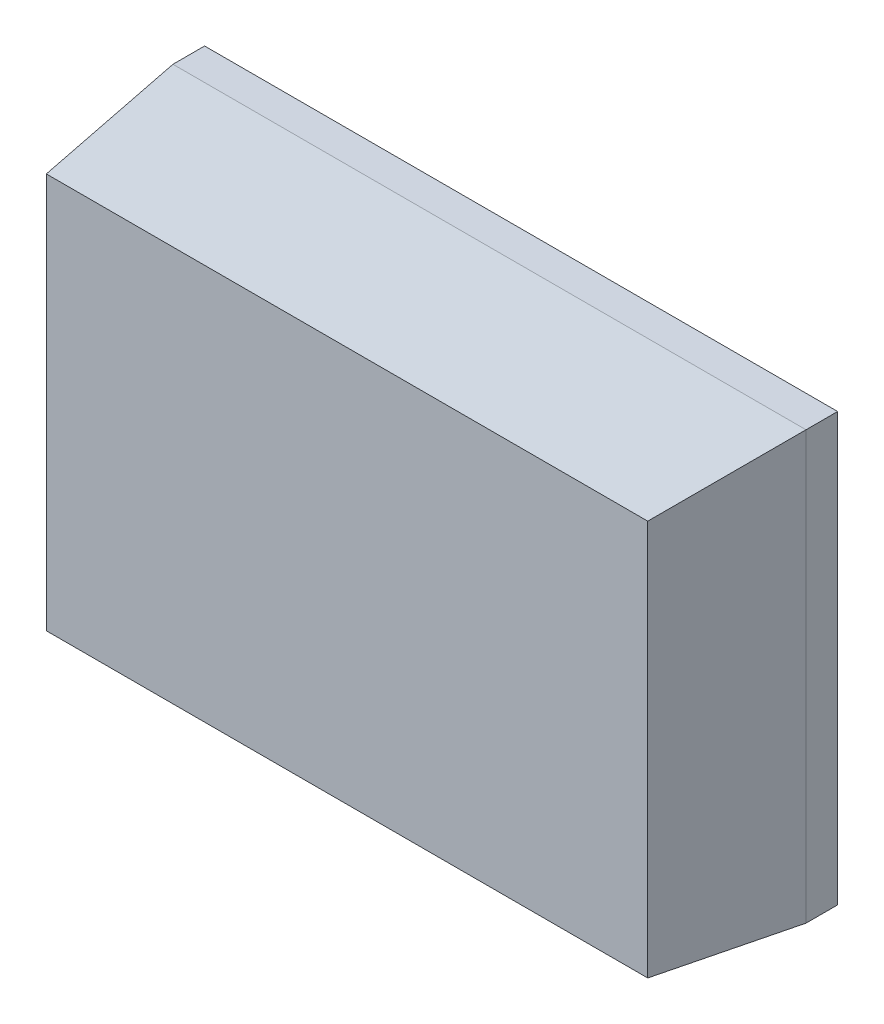
ISO-10303-21;
HEADER;
FILE_DESCRIPTION(('STEP AP214'),'2;1');
FILE_NAME('part.step','',(''),(''),'','','');
FILE_SCHEMA(('AUTOMOTIVE_DESIGN { 1 0 10303 214 1 1 1 1 }'));
ENDSEC;
DATA;
#1=APPLICATION_CONTEXT('core data for automotive mechanical design processes');
#2=APPLICATION_PROTOCOL_DEFINITION('international standard','automotive_design',2000,#1);
#3=PRODUCT_CONTEXT('',#1,'mechanical');
#4=PRODUCT('Part','Part','',(#3));
#5=PRODUCT_RELATED_PRODUCT_CATEGORY('part','',(#4));
#6=PRODUCT_DEFINITION_FORMATION('','',#4);
#7=PRODUCT_DEFINITION_CONTEXT('part definition',#1,'design');
#8=PRODUCT_DEFINITION('design','',#6,#7);
#9=PRODUCT_DEFINITION_SHAPE('','',#8);
#10=(LENGTH_UNIT() NAMED_UNIT(*) SI_UNIT(.MILLI.,.METRE.));
#11=(NAMED_UNIT(*) PLANE_ANGLE_UNIT() SI_UNIT($,.RADIAN.));
#12=(NAMED_UNIT(*) SI_UNIT($,.STERADIAN.) SOLID_ANGLE_UNIT());
#13=UNCERTAINTY_MEASURE_WITH_UNIT(LENGTH_MEASURE(1.E-05),#10,'distance_accuracy_value','');
#14=(GEOMETRIC_REPRESENTATION_CONTEXT(3) GLOBAL_UNCERTAINTY_ASSIGNED_CONTEXT((#13)) GLOBAL_UNIT_ASSIGNED_CONTEXT((#10,
#11,#12)) REPRESENTATION_CONTEXT('',''));
#15=CARTESIAN_POINT('',(0.,0.,0.));
#16=DIRECTION('',(0.,0.,1.));
#17=DIRECTION('',(1.,0.,0.));
#18=AXIS2_PLACEMENT_3D('',#15,#16,#17);
#19=CARTESIAN_POINT('',(0.,0.,1.1));
#20=DIRECTION('',(0.,0.,1.));
#21=DIRECTION('',(1.,0.,0.));
#22=AXIS2_PLACEMENT_3D('',#19,#20,#21);
#23=PLANE('',#22);
#24=DIRECTION('',(1.,0.,0.));
#25=VECTOR('',#24,1.);
#26=CARTESIAN_POINT('',(0.,0.1,1.1));
#27=LINE('',#26,#25);
#28=CARTESIAN_POINT('',(3.9,0.1,1.1));
#29=VERTEX_POINT('',#28);
#30=CARTESIAN_POINT('',(0.1,0.1,1.1));
#31=VERTEX_POINT('',#30);
#32=EDGE_CURVE('E71',#29,#31,#27,.F.);
#33=ORIENTED_EDGE('',*,*,#32,.F.);
#34=DIRECTION('',(0.,1.,0.));
#35=VECTOR('',#34,1.);
#36=CARTESIAN_POINT('',(3.9,0.,1.1));
#37=LINE('',#36,#35);
#38=CARTESIAN_POINT('',(3.9,2.6,1.1));
#39=VERTEX_POINT('',#38);
#40=EDGE_CURVE('E66',#39,#29,#37,.F.);
#41=ORIENTED_EDGE('',*,*,#40,.F.);
#42=DIRECTION('',(1.,0.,0.));
#43=VECTOR('',#42,1.);
#44=CARTESIAN_POINT('',(0.,2.6,1.1));
#45=LINE('',#44,#43);
#46=CARTESIAN_POINT('',(0.1,2.6,1.1));
#47=VERTEX_POINT('',#46);
#48=EDGE_CURVE('E82',#47,#39,#45,.T.);
#49=ORIENTED_EDGE('',*,*,#48,.F.);
#50=DIRECTION('',(0.,1.,0.));
#51=VECTOR('',#50,1.);
#52=CARTESIAN_POINT('',(0.1,0.,1.1));
#53=LINE('',#52,#51);
#54=EDGE_CURVE('E20',#31,#47,#53,.T.);
#55=ORIENTED_EDGE('',*,*,#54,.F.);
#56=EDGE_LOOP('',(#33,#41,#49,#55));
#57=FACE_BOUND('',#56,.T.);
#58=ADVANCED_FACE('F17',(#57),#23,.T.);
#59=CARTESIAN_POINT('',(0.1,0.,1.1));
#60=DIRECTION('',(-0.993883734673607,0.,0.110431526074956));
#61=DIRECTION('',(0.110431526074956,0.,0.993883734673607));
#62=AXIS2_PLACEMENT_3D('',#59,#60,#61);
#63=PLANE('',#62);
#64=DIRECTION('',(-0.10976425998969,-0.109764259989799,-0.987878339907201));
#65=VECTOR('',#64,1.);
#66=CARTESIAN_POINT('',(0.1,0.1,1.1));
#67=LINE('',#66,#65);
#68=CARTESIAN_POINT('',(0.,0.,0.200000000000007));
#69=VERTEX_POINT('',#68);
#70=EDGE_CURVE('E76',#31,#69,#67,.T.);
#71=ORIENTED_EDGE('',*,*,#70,.F.);
#72=ORIENTED_EDGE('',*,*,#54,.T.);
#73=DIRECTION('',(0.10976425998969,-0.1097642599898,0.987878339907201));
#74=VECTOR('',#73,1.);
#75=CARTESIAN_POINT('',(0.,2.7000000000001,0.200000000000011));
#76=LINE('',#75,#74);
#77=CARTESIAN_POINT('',(0.,2.70000000000001,0.200000000000007));
#78=VERTEX_POINT('',#77);
#79=EDGE_CURVE('E95',#78,#47,#76,.T.);
#80=ORIENTED_EDGE('',*,*,#79,.F.);
#81=DIRECTION('',(0.,1.,0.));
#82=VECTOR('',#81,1.);
#83=CARTESIAN_POINT('',(0.,2.7,0.2));
#84=LINE('',#83,#82);
#85=EDGE_CURVE('E87',#78,#69,#84,.F.);
#86=ORIENTED_EDGE('',*,*,#85,.T.);
#87=EDGE_LOOP('',(#71,#72,#80,#86));
#88=FACE_BOUND('',#87,.T.);
#89=ADVANCED_FACE('F86',(#88),#63,.T.);
#90=CARTESIAN_POINT('',(0.,0.1,1.1));
#91=DIRECTION('',(0.,-0.993883734673607,0.110431526074956));
#92=DIRECTION('',(0.,-0.110431526074956,-0.993883734673607));
#93=AXIS2_PLACEMENT_3D('',#90,#91,#92);
#94=PLANE('',#93);
#95=DIRECTION('',(1.,0.,0.));
#96=VECTOR('',#95,1.);
#97=CARTESIAN_POINT('',(0.,0.,0.2));
#98=LINE('',#97,#96);
#99=CARTESIAN_POINT('',(4.00000000000001,0.,0.200000000000007));
#100=VERTEX_POINT('',#99);
#101=EDGE_CURVE('E102',#69,#100,#98,.T.);
#102=ORIENTED_EDGE('',*,*,#101,.T.);
#103=DIRECTION('',(0.109764259989799,-0.109764259989691,-0.987878339907201));
#104=VECTOR('',#103,1.);
#105=CARTESIAN_POINT('',(3.9,0.1,1.1));
#106=LINE('',#105,#104);
#107=EDGE_CURVE('E78',#29,#100,#106,.T.);
#108=ORIENTED_EDGE('',*,*,#107,.F.);
#109=ORIENTED_EDGE('',*,*,#32,.T.);
#110=ORIENTED_EDGE('',*,*,#70,.T.);
#111=EDGE_LOOP('',(#102,#108,#109,#110));
#112=FACE_BOUND('',#111,.T.);
#113=ADVANCED_FACE('F74',(#112),#94,.T.);
#114=CARTESIAN_POINT('',(3.9,0.,1.1));
#115=DIRECTION('',(0.993883734673607,0.,0.110431526074956));
#116=DIRECTION('',(0.110431526074956,0.,-0.993883734673607));
#117=AXIS2_PLACEMENT_3D('',#114,#115,#116);
#118=PLANE('',#117);
#119=ORIENTED_EDGE('',*,*,#107,.T.);
#120=DIRECTION('',(0.,1.,0.));
#121=VECTOR('',#120,1.);
#122=CARTESIAN_POINT('',(4.,0.,0.2));
#123=LINE('',#122,#121);
#124=CARTESIAN_POINT('',(4.00000000000005,2.70000000000001,0.200000000000007));
#125=VERTEX_POINT('',#124);
#126=EDGE_CURVE('E107',#100,#125,#123,.T.);
#127=ORIENTED_EDGE('',*,*,#126,.T.);
#128=DIRECTION('',(0.109764259989691,0.1097642599898,-0.987878339907201));
#129=VECTOR('',#128,1.);
#130=CARTESIAN_POINT('',(3.9,2.6,1.1));
#131=LINE('',#130,#129);
#132=EDGE_CURVE('E93',#39,#125,#131,.T.);
#133=ORIENTED_EDGE('',*,*,#132,.F.);
#134=ORIENTED_EDGE('',*,*,#40,.T.);
#135=EDGE_LOOP('',(#119,#127,#133,#134));
#136=FACE_BOUND('',#135,.T.);
#137=ADVANCED_FACE('F154',(#136),#118,.T.);
#138=CARTESIAN_POINT('',(0.,2.6,1.1));
#139=DIRECTION('',(0.,0.993883734673607,0.110431526074956));
#140=DIRECTION('',(0.,-0.110431526074956,0.993883734673607));
#141=AXIS2_PLACEMENT_3D('',#138,#139,#140);
#142=PLANE('',#141);
#143=ORIENTED_EDGE('',*,*,#79,.T.);
#144=ORIENTED_EDGE('',*,*,#48,.T.);
#145=ORIENTED_EDGE('',*,*,#132,.T.);
#146=DIRECTION('',(1.,0.,0.));
#147=VECTOR('',#146,1.);
#148=CARTESIAN_POINT('',(4.,2.7,0.2));
#149=LINE('',#148,#147);
#150=EDGE_CURVE('E114',#125,#78,#149,.F.);
#151=ORIENTED_EDGE('',*,*,#150,.T.);
#152=EDGE_LOOP('',(#143,#144,#145,#151));
#153=FACE_BOUND('',#152,.T.);
#154=ADVANCED_FACE('F151',(#153),#142,.T.);
#155=CARTESIAN_POINT('',(0.,2.7,1.1));
#156=DIRECTION('',(1.,0.,0.));
#157=DIRECTION('',(0.,0.,-1.));
#158=AXIS2_PLACEMENT_3D('',#155,#156,#157);
#159=PLANE('',#158);
#160=DIRECTION('',(0.,0.,-1.));
#161=VECTOR('',#160,1.);
#162=CARTESIAN_POINT('',(0.,2.7,1.1));
#163=LINE('',#162,#161);
#164=CARTESIAN_POINT('',(0.,2.7,0.));
#165=VERTEX_POINT('',#164);
#166=EDGE_CURVE('E110',#78,#165,#163,.T.);
#167=ORIENTED_EDGE('',*,*,#166,.T.);
#168=DIRECTION('',(0.,1.,0.));
#169=VECTOR('',#168,1.);
#170=CARTESIAN_POINT('',(0.,0.,0.));
#171=LINE('',#170,#169);
#172=CARTESIAN_POINT('',(0.,0.,0.));
#173=VERTEX_POINT('',#172);
#174=EDGE_CURVE('E117',#165,#173,#171,.F.);
#175=ORIENTED_EDGE('',*,*,#174,.T.);
#176=DIRECTION('',(0.,0.,1.));
#177=VECTOR('',#176,1.);
#178=CARTESIAN_POINT('',(0.,0.,1.1));
#179=LINE('',#178,#177);
#180=EDGE_CURVE('E99',#173,#69,#179,.T.);
#181=ORIENTED_EDGE('',*,*,#180,.T.);
#182=ORIENTED_EDGE('',*,*,#85,.F.);
#183=EDGE_LOOP('',(#167,#175,#181,#182));
#184=FACE_BOUND('',#183,.T.);
#185=ADVANCED_FACE('F134',(#184),#159,.F.);
#186=CARTESIAN_POINT('',(0.,0.,1.1));
#187=DIRECTION('',(0.,1.,0.));
#188=DIRECTION('',(0.,0.,1.));
#189=AXIS2_PLACEMENT_3D('',#186,#187,#188);
#190=PLANE('',#189);
#191=ORIENTED_EDGE('',*,*,#180,.F.);
#192=DIRECTION('',(1.,0.,0.));
#193=VECTOR('',#192,1.);
#194=CARTESIAN_POINT('',(0.,0.,0.));
#195=LINE('',#194,#193);
#196=CARTESIAN_POINT('',(4.,0.,0.));
#197=VERTEX_POINT('',#196);
#198=EDGE_CURVE('E120',#173,#197,#195,.T.);
#199=ORIENTED_EDGE('',*,*,#198,.T.);
#200=DIRECTION('',(0.,0.,1.));
#201=VECTOR('',#200,1.);
#202=CARTESIAN_POINT('',(4.,0.,1.1));
#203=LINE('',#202,#201);
#204=EDGE_CURVE('E104',#197,#100,#203,.T.);
#205=ORIENTED_EDGE('',*,*,#204,.T.);
#206=ORIENTED_EDGE('',*,*,#101,.F.);
#207=EDGE_LOOP('',(#191,#199,#205,#206));
#208=FACE_BOUND('',#207,.T.);
#209=ADVANCED_FACE('F132',(#208),#190,.F.);
#210=CARTESIAN_POINT('',(4.,0.,1.1));
#211=DIRECTION('',(-1.,0.,0.));
#212=DIRECTION('',(0.,0.,1.));
#213=AXIS2_PLACEMENT_3D('',#210,#211,#212);
#214=PLANE('',#213);
#215=ORIENTED_EDGE('',*,*,#204,.F.);
#216=DIRECTION('',(0.,1.,0.));
#217=VECTOR('',#216,1.);
#218=CARTESIAN_POINT('',(4.,0.,0.));
#219=LINE('',#218,#217);
#220=CARTESIAN_POINT('',(4.,2.7,0.));
#221=VERTEX_POINT('',#220);
#222=EDGE_CURVE('E26',#197,#221,#219,.T.);
#223=ORIENTED_EDGE('',*,*,#222,.T.);
#224=DIRECTION('',(0.,0.,-1.));
#225=VECTOR('',#224,1.);
#226=CARTESIAN_POINT('',(4.,2.7,1.1));
#227=LINE('',#226,#225);
#228=EDGE_CURVE('E34',#221,#125,#227,.F.);
#229=ORIENTED_EDGE('',*,*,#228,.T.);
#230=ORIENTED_EDGE('',*,*,#126,.F.);
#231=EDGE_LOOP('',(#215,#223,#229,#230));
#232=FACE_BOUND('',#231,.T.);
#233=ADVANCED_FACE('F126',(#232),#214,.F.);
#234=CARTESIAN_POINT('',(4.,2.7,1.1));
#235=DIRECTION('',(0.,-1.,0.));
#236=DIRECTION('',(0.,0.,-1.));
#237=AXIS2_PLACEMENT_3D('',#234,#235,#236);
#238=PLANE('',#237);
#239=ORIENTED_EDGE('',*,*,#228,.F.);
#240=DIRECTION('',(1.,0.,0.));
#241=VECTOR('',#240,1.);
#242=CARTESIAN_POINT('',(0.,2.7,0.));
#243=LINE('',#242,#241);
#244=EDGE_CURVE('E11',#221,#165,#243,.F.);
#245=ORIENTED_EDGE('',*,*,#244,.T.);
#246=ORIENTED_EDGE('',*,*,#166,.F.);
#247=ORIENTED_EDGE('',*,*,#150,.F.);
#248=EDGE_LOOP('',(#239,#245,#246,#247));
#249=FACE_BOUND('',#248,.T.);
#250=ADVANCED_FACE('F136',(#249),#238,.F.);
#251=CARTESIAN_POINT('',(0.,0.,0.));
#252=DIRECTION('',(0.,0.,1.));
#253=DIRECTION('',(1.,0.,0.));
#254=AXIS2_PLACEMENT_3D('',#251,#252,#253);
#255=PLANE('',#254);
#256=ORIENTED_EDGE('',*,*,#222,.F.);
#257=ORIENTED_EDGE('',*,*,#198,.F.);
#258=ORIENTED_EDGE('',*,*,#174,.F.);
#259=ORIENTED_EDGE('',*,*,#244,.F.);
#260=EDGE_LOOP('',(#256,#257,#258,#259));
#261=FACE_BOUND('',#260,.T.);
#262=ADVANCED_FACE('F130',(#261),#255,.F.);
#263=CLOSED_SHELL('',(#58,#89,#113,#137,#154,#185,#209,#233,#250,#262));
#264=MANIFOLD_SOLID_BREP('B1',#263);
#265=ADVANCED_BREP_SHAPE_REPRESENTATION('',(#18,#264),#14);
#266=SHAPE_DEFINITION_REPRESENTATION(#9,#265);
ENDSEC;
END-ISO-10303-21;
